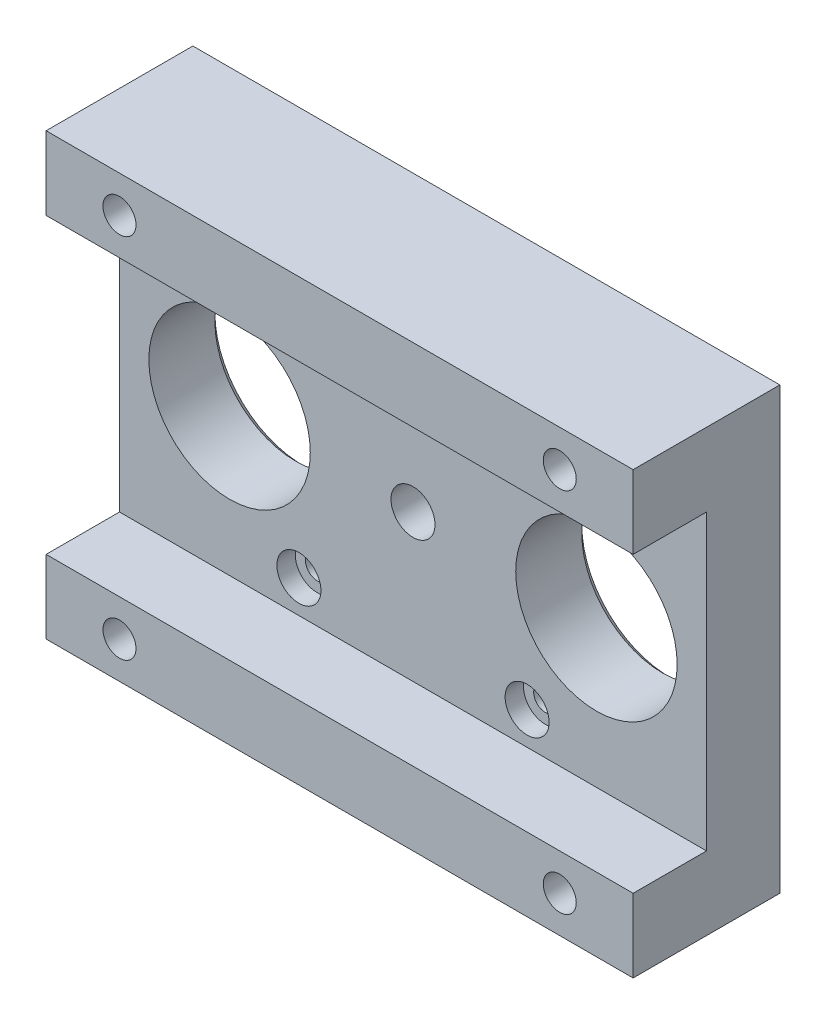
ISO-10303-21;
HEADER;
FILE_DESCRIPTION(('STEP AP214'),'2;1');
FILE_NAME('part.step','',(''),(''),'','','');
FILE_SCHEMA(('AUTOMOTIVE_DESIGN { 1 0 10303 214 1 1 1 1 }'));
ENDSEC;
DATA;
#1=APPLICATION_CONTEXT('core data for automotive mechanical design processes');
#2=APPLICATION_PROTOCOL_DEFINITION('international standard','automotive_design',2000,#1);
#3=PRODUCT_CONTEXT('',#1,'mechanical');
#4=PRODUCT('Part','Part','',(#3));
#5=PRODUCT_RELATED_PRODUCT_CATEGORY('part','',(#4));
#6=PRODUCT_DEFINITION_FORMATION('','',#4);
#7=PRODUCT_DEFINITION_CONTEXT('part definition',#1,'design');
#8=PRODUCT_DEFINITION('design','',#6,#7);
#9=PRODUCT_DEFINITION_SHAPE('','',#8);
#10=(LENGTH_UNIT() NAMED_UNIT(*) SI_UNIT(.MILLI.,.METRE.));
#11=(NAMED_UNIT(*) PLANE_ANGLE_UNIT() SI_UNIT($,.RADIAN.));
#12=(NAMED_UNIT(*) SI_UNIT($,.STERADIAN.) SOLID_ANGLE_UNIT());
#13=UNCERTAINTY_MEASURE_WITH_UNIT(LENGTH_MEASURE(1.E-05),#10,'distance_accuracy_value','');
#14=(GEOMETRIC_REPRESENTATION_CONTEXT(3) GLOBAL_UNCERTAINTY_ASSIGNED_CONTEXT((#13)) GLOBAL_UNIT_ASSIGNED_CONTEXT((#10,
#11,#12)) REPRESENTATION_CONTEXT('',''));
#15=CARTESIAN_POINT('',(0.,0.,0.));
#16=DIRECTION('',(0.,0.,1.));
#17=DIRECTION('',(1.,0.,0.));
#18=AXIS2_PLACEMENT_3D('',#15,#16,#17);
#19=CARTESIAN_POINT('',(-15.55,15.55,-2.2));
#20=DIRECTION('',(0.,0.,1.));
#21=DIRECTION('',(1.,0.,0.));
#22=AXIS2_PLACEMENT_3D('',#19,#20,#21);
#23=CYLINDRICAL_SURFACE('',#22,1.6);
#24=CARTESIAN_POINT('',(-15.55,15.55,0.));
#25=DIRECTION('',(0.,0.,1.));
#26=DIRECTION('',(1.,0.,0.));
#27=AXIS2_PLACEMENT_3D('',#24,#25,#26);
#28=CIRCLE('',#27,1.6);
#29=CARTESIAN_POINT('',(-13.95,15.55,0.));
#30=VERTEX_POINT('',#29);
#31=EDGE_CURVE('E183',#30,#30,#28,.T.);
#32=ORIENTED_EDGE('',*,*,#31,.F.);
#33=EDGE_LOOP('',(#32));
#34=FACE_BOUND('',#33,.T.);
#35=CARTESIAN_POINT('',(-15.55,15.55,7.5));
#36=DIRECTION('',(0.,0.,1.));
#37=DIRECTION('',(1.,0.,0.));
#38=AXIS2_PLACEMENT_3D('',#35,#36,#37);
#39=CIRCLE('',#38,1.6);
#40=CARTESIAN_POINT('',(-13.95,15.55,7.5));
#41=VERTEX_POINT('',#40);
#42=EDGE_CURVE('E187',#41,#41,#39,.F.);
#43=ORIENTED_EDGE('',*,*,#42,.F.);
#44=EDGE_LOOP('',(#43));
#45=FACE_BOUND('',#44,.T.);
#46=ADVANCED_FACE('F44',(#34,#45),#23,.F.);
#47=CARTESIAN_POINT('',(15.55,15.55,-2.2));
#48=DIRECTION('',(0.,0.,1.));
#49=DIRECTION('',(1.,0.,0.));
#50=AXIS2_PLACEMENT_3D('',#47,#48,#49);
#51=CYLINDRICAL_SURFACE('',#50,1.6);
#52=CARTESIAN_POINT('',(15.55,15.55,0.));
#53=DIRECTION('',(0.,0.,1.));
#54=DIRECTION('',(1.,0.,0.));
#55=AXIS2_PLACEMENT_3D('',#52,#53,#54);
#56=CIRCLE('',#55,1.6);
#57=CARTESIAN_POINT('',(17.15,15.55,0.));
#58=VERTEX_POINT('',#57);
#59=EDGE_CURVE('E186',#58,#58,#56,.T.);
#60=ORIENTED_EDGE('',*,*,#59,.F.);
#61=EDGE_LOOP('',(#60));
#62=FACE_BOUND('',#61,.T.);
#63=CARTESIAN_POINT('',(15.55,15.55,7.5));
#64=DIRECTION('',(0.,0.,1.));
#65=DIRECTION('',(1.,0.,0.));
#66=AXIS2_PLACEMENT_3D('',#63,#64,#65);
#67=CIRCLE('',#66,1.6);
#68=CARTESIAN_POINT('',(17.15,15.55,7.5));
#69=VERTEX_POINT('',#68);
#70=EDGE_CURVE('E204',#69,#69,#67,.F.);
#71=ORIENTED_EDGE('',*,*,#70,.F.);
#72=EDGE_LOOP('',(#71));
#73=FACE_BOUND('',#72,.T.);
#74=ADVANCED_FACE('F362',(#62,#73),#51,.F.);
#75=CARTESIAN_POINT('',(15.55,-15.55,-2.2));
#76=DIRECTION('',(0.,0.,1.));
#77=DIRECTION('',(1.,0.,0.));
#78=AXIS2_PLACEMENT_3D('',#75,#76,#77);
#79=CYLINDRICAL_SURFACE('',#78,1.6);
#80=CARTESIAN_POINT('',(15.55,-15.55,0.));
#81=DIRECTION('',(0.,0.,1.));
#82=DIRECTION('',(1.,0.,0.));
#83=AXIS2_PLACEMENT_3D('',#80,#81,#82);
#84=CIRCLE('',#83,1.6);
#85=CARTESIAN_POINT('',(17.15,-15.55,0.));
#86=VERTEX_POINT('',#85);
#87=EDGE_CURVE('E190',#86,#86,#84,.T.);
#88=ORIENTED_EDGE('',*,*,#87,.F.);
#89=EDGE_LOOP('',(#88));
#90=FACE_BOUND('',#89,.T.);
#91=CARTESIAN_POINT('',(15.55,-15.55,7.5));
#92=DIRECTION('',(0.,0.,1.));
#93=DIRECTION('',(1.,0.,0.));
#94=AXIS2_PLACEMENT_3D('',#91,#92,#93);
#95=CIRCLE('',#94,1.6);
#96=CARTESIAN_POINT('',(17.15,-15.55,7.5));
#97=VERTEX_POINT('',#96);
#98=EDGE_CURVE('E200',#97,#97,#95,.F.);
#99=ORIENTED_EDGE('',*,*,#98,.F.);
#100=EDGE_LOOP('',(#99));
#101=FACE_BOUND('',#100,.T.);
#102=ADVANCED_FACE('F368',(#90,#101),#79,.F.);
#103=CARTESIAN_POINT('',(-15.55,-15.55,-2.2));
#104=DIRECTION('',(0.,0.,1.));
#105=DIRECTION('',(1.,0.,0.));
#106=AXIS2_PLACEMENT_3D('',#103,#104,#105);
#107=CYLINDRICAL_SURFACE('',#106,1.6);
#108=CARTESIAN_POINT('',(-15.55,-15.55,0.));
#109=DIRECTION('',(0.,0.,1.));
#110=DIRECTION('',(1.,0.,0.));
#111=AXIS2_PLACEMENT_3D('',#108,#109,#110);
#112=CIRCLE('',#111,1.6);
#113=CARTESIAN_POINT('',(-13.95,-15.55,0.));
#114=VERTEX_POINT('',#113);
#115=EDGE_CURVE('E193',#114,#114,#112,.T.);
#116=ORIENTED_EDGE('',*,*,#115,.F.);
#117=EDGE_LOOP('',(#116));
#118=FACE_BOUND('',#117,.T.);
#119=CARTESIAN_POINT('',(-15.55,-15.55,7.5));
#120=DIRECTION('',(0.,0.,1.));
#121=DIRECTION('',(1.,0.,0.));
#122=AXIS2_PLACEMENT_3D('',#119,#120,#121);
#123=CIRCLE('',#122,1.6);
#124=CARTESIAN_POINT('',(-13.95,-15.55,7.5));
#125=VERTEX_POINT('',#124);
#126=EDGE_CURVE('E197',#125,#125,#123,.F.);
#127=ORIENTED_EDGE('',*,*,#126,.F.);
#128=EDGE_LOOP('',(#127));
#129=FACE_BOUND('',#128,.T.);
#130=ADVANCED_FACE('F327',(#118,#129),#107,.F.);
#131=CARTESIAN_POINT('',(0.,0.,10.));
#132=DIRECTION('',(0.,0.,1.));
#133=DIRECTION('',(1.,0.,0.));
#134=AXIS2_PLACEMENT_3D('',#131,#132,#133);
#135=PLANE('',#134);
#136=CARTESIAN_POINT('',(15.55,15.55,10.));
#137=DIRECTION('',(0.,0.,1.));
#138=DIRECTION('',(1.,0.,0.));
#139=AXIS2_PLACEMENT_3D('',#136,#137,#138);
#140=CIRCLE('',#139,3.);
#141=CARTESIAN_POINT('',(18.55,15.55,10.));
#142=VERTEX_POINT('',#141);
#143=EDGE_CURVE('E301',#142,#142,#140,.T.);
#144=ORIENTED_EDGE('',*,*,#143,.F.);
#145=EDGE_LOOP('',(#144));
#146=FACE_BOUND('',#145,.T.);
#147=CARTESIAN_POINT('',(-15.55,-15.55,10.));
#148=DIRECTION('',(0.,0.,1.));
#149=DIRECTION('',(1.,0.,0.));
#150=AXIS2_PLACEMENT_3D('',#147,#148,#149);
#151=CIRCLE('',#150,3.);
#152=CARTESIAN_POINT('',(-12.55,-15.55,10.));
#153=VERTEX_POINT('',#152);
#154=EDGE_CURVE('E307',#153,#153,#151,.T.);
#155=ORIENTED_EDGE('',*,*,#154,.F.);
#156=EDGE_LOOP('',(#155));
#157=FACE_BOUND('',#156,.T.);
#158=CARTESIAN_POINT('',(15.55,-15.55,10.));
#159=DIRECTION('',(0.,0.,1.));
#160=DIRECTION('',(1.,0.,0.));
#161=AXIS2_PLACEMENT_3D('',#158,#159,#160);
#162=CIRCLE('',#161,3.);
#163=CARTESIAN_POINT('',(18.55,-15.55,10.));
#164=VERTEX_POINT('',#163);
#165=EDGE_CURVE('E308',#164,#164,#162,.T.);
#166=ORIENTED_EDGE('',*,*,#165,.F.);
#167=EDGE_LOOP('',(#166));
#168=FACE_BOUND('',#167,.T.);
#169=CARTESIAN_POINT('',(-15.55,15.55,10.));
#170=DIRECTION('',(0.,0.,1.));
#171=DIRECTION('',(1.,0.,0.));
#172=AXIS2_PLACEMENT_3D('',#169,#170,#171);
#173=CIRCLE('',#172,3.);
#174=CARTESIAN_POINT('',(-12.55,15.55,10.));
#175=VERTEX_POINT('',#174);
#176=EDGE_CURVE('E298',#175,#175,#173,.T.);
#177=ORIENTED_EDGE('',*,*,#176,.F.);
#178=EDGE_LOOP('',(#177));
#179=FACE_BOUND('',#178,.T.);
#180=CARTESIAN_POINT('',(-25.,0.,10.));
#181=DIRECTION('',(0.,0.,1.));
#182=DIRECTION('',(1.,0.,0.));
#183=AXIS2_PLACEMENT_3D('',#180,#181,#182);
#184=CIRCLE('',#183,11.);
#185=CARTESIAN_POINT('',(-14.,0.,10.));
#186=VERTEX_POINT('',#185);
#187=EDGE_CURVE('E280',#186,#186,#184,.T.);
#188=ORIENTED_EDGE('',*,*,#187,.F.);
#189=EDGE_LOOP('',(#188));
#190=FACE_BOUND('',#189,.T.);
#191=CARTESIAN_POINT('',(25.,0.,10.));
#192=DIRECTION('',(0.,0.,1.));
#193=DIRECTION('',(1.,0.,0.));
#194=AXIS2_PLACEMENT_3D('',#191,#192,#193);
#195=CIRCLE('',#194,11.);
#196=CARTESIAN_POINT('',(36.,0.,10.));
#197=VERTEX_POINT('',#196);
#198=EDGE_CURVE('E196',#197,#197,#195,.T.);
#199=ORIENTED_EDGE('',*,*,#198,.F.);
#200=EDGE_LOOP('',(#199));
#201=FACE_BOUND('',#200,.T.);
#202=CARTESIAN_POINT('',(0.,0.,10.));
#203=DIRECTION('',(0.,0.,1.));
#204=DIRECTION('',(1.,0.,0.));
#205=AXIS2_PLACEMENT_3D('',#202,#203,#204);
#206=CIRCLE('',#205,3.);
#207=CARTESIAN_POINT('',(-3.,0.,10.));
#208=VERTEX_POINT('',#207);
#209=EDGE_CURVE('E178',#208,#208,#206,.T.);
#210=ORIENTED_EDGE('',*,*,#209,.F.);
#211=EDGE_LOOP('',(#210));
#212=FACE_BOUND('',#211,.T.);
#213=DIRECTION('',(0.,-1.,0.));
#214=VECTOR('',#213,1.);
#215=CARTESIAN_POINT('',(-40.,30.,10.));
#216=LINE('',#215,#214);
#217=CARTESIAN_POINT('',(-40.,20.,10.));
#218=VERTEX_POINT('',#217);
#219=CARTESIAN_POINT('',(-40.,-20.,10.));
#220=VERTEX_POINT('',#219);
#221=EDGE_CURVE('E65',#218,#220,#216,.T.);
#222=ORIENTED_EDGE('',*,*,#221,.T.);
#223=DIRECTION('',(-1.,0.,0.));
#224=VECTOR('',#223,1.);
#225=CARTESIAN_POINT('',(40.,-20.,10.));
#226=LINE('',#225,#224);
#227=CARTESIAN_POINT('',(40.,-20.,10.));
#228=VERTEX_POINT('',#227);
#229=EDGE_CURVE('E60',#228,#220,#226,.T.);
#230=ORIENTED_EDGE('',*,*,#229,.F.);
#231=DIRECTION('',(0.,1.,0.));
#232=VECTOR('',#231,1.);
#233=CARTESIAN_POINT('',(40.,30.,10.));
#234=LINE('',#233,#232);
#235=CARTESIAN_POINT('',(40.,20.,10.));
#236=VERTEX_POINT('',#235);
#237=EDGE_CURVE('E161',#228,#236,#234,.T.);
#238=ORIENTED_EDGE('',*,*,#237,.T.);
#239=DIRECTION('',(1.,0.,0.));
#240=VECTOR('',#239,1.);
#241=CARTESIAN_POINT('',(-40.,20.,10.));
#242=LINE('',#241,#240);
#243=EDGE_CURVE('E136',#218,#236,#242,.T.);
#244=ORIENTED_EDGE('',*,*,#243,.F.);
#245=EDGE_LOOP('',(#222,#230,#238,#244));
#246=FACE_BOUND('',#245,.T.);
#247=ADVANCED_FACE('F324',(#146,#157,#168,#179,#190,#201,#212,#246),#135,.T.);
#248=CARTESIAN_POINT('',(40.,30.,10.));
#249=DIRECTION('',(-1.,0.,0.));
#250=DIRECTION('',(0.,-1.,0.));
#251=AXIS2_PLACEMENT_3D('',#248,#249,#250);
#252=PLANE('',#251);
#253=DIRECTION('',(0.,1.,0.));
#254=VECTOR('',#253,1.);
#255=CARTESIAN_POINT('',(40.,30.,0.));
#256=LINE('',#255,#254);
#257=CARTESIAN_POINT('',(40.,-30.,0.));
#258=VERTEX_POINT('',#257);
#259=CARTESIAN_POINT('',(40.,30.,0.));
#260=VERTEX_POINT('',#259);
#261=EDGE_CURVE('E160',#258,#260,#256,.T.);
#262=ORIENTED_EDGE('',*,*,#261,.T.);
#263=DIRECTION('',(0.,0.,-1.));
#264=VECTOR('',#263,1.);
#265=CARTESIAN_POINT('',(40.,30.,10.));
#266=LINE('',#265,#264);
#267=CARTESIAN_POINT('',(40.,30.,20.));
#268=VERTEX_POINT('',#267);
#269=EDGE_CURVE('E174',#268,#260,#266,.T.);
#270=ORIENTED_EDGE('',*,*,#269,.F.);
#271=DIRECTION('',(0.,1.,0.));
#272=VECTOR('',#271,1.);
#273=CARTESIAN_POINT('',(40.,30.,20.));
#274=LINE('',#273,#272);
#275=CARTESIAN_POINT('',(40.,20.,20.));
#276=VERTEX_POINT('',#275);
#277=EDGE_CURVE('E146',#276,#268,#274,.T.);
#278=ORIENTED_EDGE('',*,*,#277,.F.);
#279=DIRECTION('',(0.,0.,-1.));
#280=VECTOR('',#279,1.);
#281=CARTESIAN_POINT('',(40.,20.,20.));
#282=LINE('',#281,#280);
#283=EDGE_CURVE('E152',#276,#236,#282,.T.);
#284=ORIENTED_EDGE('',*,*,#283,.T.);
#285=ORIENTED_EDGE('',*,*,#237,.F.);
#286=DIRECTION('',(0.,0.,-1.));
#287=VECTOR('',#286,1.);
#288=CARTESIAN_POINT('',(40.,-20.,20.));
#289=LINE('',#288,#287);
#290=CARTESIAN_POINT('',(40.,-20.,20.));
#291=VERTEX_POINT('',#290);
#292=EDGE_CURVE('E133',#291,#228,#289,.T.);
#293=ORIENTED_EDGE('',*,*,#292,.F.);
#294=DIRECTION('',(0.,1.,0.));
#295=VECTOR('',#294,1.);
#296=CARTESIAN_POINT('',(40.,-30.,20.));
#297=LINE('',#296,#295);
#298=CARTESIAN_POINT('',(40.,-30.,20.));
#299=VERTEX_POINT('',#298);
#300=EDGE_CURVE('E125',#299,#291,#297,.T.);
#301=ORIENTED_EDGE('',*,*,#300,.F.);
#302=DIRECTION('',(0.,0.,-1.));
#303=VECTOR('',#302,1.);
#304=CARTESIAN_POINT('',(40.,-30.,10.));
#305=LINE('',#304,#303);
#306=EDGE_CURVE('E108',#299,#258,#305,.T.);
#307=ORIENTED_EDGE('',*,*,#306,.T.);
#308=EDGE_LOOP('',(#262,#270,#278,#284,#285,#293,#301,#307));
#309=FACE_BOUND('',#308,.T.);
#310=ADVANCED_FACE('F131',(#309),#252,.F.);
#311=CARTESIAN_POINT('',(-40.,30.,10.));
#312=DIRECTION('',(0.,-1.,0.));
#313=DIRECTION('',(0.,0.,-1.));
#314=AXIS2_PLACEMENT_3D('',#311,#312,#313);
#315=PLANE('',#314);
#316=DIRECTION('',(-1.,0.,0.));
#317=VECTOR('',#316,1.);
#318=CARTESIAN_POINT('',(-40.,30.,0.));
#319=LINE('',#318,#317);
#320=CARTESIAN_POINT('',(-40.,30.,0.));
#321=VERTEX_POINT('',#320);
#322=EDGE_CURVE('E165',#260,#321,#319,.T.);
#323=ORIENTED_EDGE('',*,*,#322,.T.);
#324=DIRECTION('',(0.,0.,-1.));
#325=VECTOR('',#324,1.);
#326=CARTESIAN_POINT('',(-40.,30.,10.));
#327=LINE('',#326,#325);
#328=CARTESIAN_POINT('',(-40.,30.,20.));
#329=VERTEX_POINT('',#328);
#330=EDGE_CURVE('E171',#329,#321,#327,.T.);
#331=ORIENTED_EDGE('',*,*,#330,.F.);
#332=DIRECTION('',(-1.,0.,0.));
#333=VECTOR('',#332,1.);
#334=CARTESIAN_POINT('',(-40.,30.,20.));
#335=LINE('',#334,#333);
#336=EDGE_CURVE('E149',#268,#329,#335,.T.);
#337=ORIENTED_EDGE('',*,*,#336,.F.);
#338=ORIENTED_EDGE('',*,*,#269,.T.);
#339=EDGE_LOOP('',(#323,#331,#337,#338));
#340=FACE_BOUND('',#339,.T.);
#341=ADVANCED_FACE('F251',(#340),#315,.F.);
#342=CARTESIAN_POINT('',(-40.,30.,10.));
#343=DIRECTION('',(1.,0.,0.));
#344=DIRECTION('',(0.,1.,0.));
#345=AXIS2_PLACEMENT_3D('',#342,#343,#344);
#346=PLANE('',#345);
#347=DIRECTION('',(0.,-1.,0.));
#348=VECTOR('',#347,1.);
#349=CARTESIAN_POINT('',(-40.,30.,0.));
#350=LINE('',#349,#348);
#351=CARTESIAN_POINT('',(-40.,-30.,0.));
#352=VERTEX_POINT('',#351);
#353=EDGE_CURVE('E167',#321,#352,#350,.T.);
#354=ORIENTED_EDGE('',*,*,#353,.T.);
#355=DIRECTION('',(0.,0.,-1.));
#356=VECTOR('',#355,1.);
#357=CARTESIAN_POINT('',(-40.,-30.,10.));
#358=LINE('',#357,#356);
#359=CARTESIAN_POINT('',(-40.,-30.,20.));
#360=VERTEX_POINT('',#359);
#361=EDGE_CURVE('E119',#360,#352,#358,.T.);
#362=ORIENTED_EDGE('',*,*,#361,.F.);
#363=DIRECTION('',(0.,-1.,0.));
#364=VECTOR('',#363,1.);
#365=CARTESIAN_POINT('',(-40.,-30.,20.));
#366=LINE('',#365,#364);
#367=CARTESIAN_POINT('',(-40.,-20.,20.));
#368=VERTEX_POINT('',#367);
#369=EDGE_CURVE('E128',#368,#360,#366,.T.);
#370=ORIENTED_EDGE('',*,*,#369,.F.);
#371=DIRECTION('',(0.,0.,-1.));
#372=VECTOR('',#371,1.);
#373=CARTESIAN_POINT('',(-40.,-20.,20.));
#374=LINE('',#373,#372);
#375=EDGE_CURVE('E129',#368,#220,#374,.T.);
#376=ORIENTED_EDGE('',*,*,#375,.T.);
#377=ORIENTED_EDGE('',*,*,#221,.F.);
#378=DIRECTION('',(0.,0.,-1.));
#379=VECTOR('',#378,1.);
#380=CARTESIAN_POINT('',(-40.,20.,20.));
#381=LINE('',#380,#379);
#382=CARTESIAN_POINT('',(-40.,20.,20.));
#383=VERTEX_POINT('',#382);
#384=EDGE_CURVE('E157',#383,#218,#381,.T.);
#385=ORIENTED_EDGE('',*,*,#384,.F.);
#386=DIRECTION('',(0.,-1.,0.));
#387=VECTOR('',#386,1.);
#388=CARTESIAN_POINT('',(-40.,30.,20.));
#389=LINE('',#388,#387);
#390=EDGE_CURVE('E141',#329,#383,#389,.T.);
#391=ORIENTED_EDGE('',*,*,#390,.F.);
#392=ORIENTED_EDGE('',*,*,#330,.T.);
#393=EDGE_LOOP('',(#354,#362,#370,#376,#377,#385,#391,#392));
#394=FACE_BOUND('',#393,.T.);
#395=ADVANCED_FACE('F253',(#394),#346,.F.);
#396=CARTESIAN_POINT('',(-40.,-30.,10.));
#397=DIRECTION('',(0.,1.,0.));
#398=DIRECTION('',(0.,0.,1.));
#399=AXIS2_PLACEMENT_3D('',#396,#397,#398);
#400=PLANE('',#399);
#401=DIRECTION('',(1.,0.,0.));
#402=VECTOR('',#401,1.);
#403=CARTESIAN_POINT('',(-40.,-30.,0.));
#404=LINE('',#403,#402);
#405=EDGE_CURVE('E114',#352,#258,#404,.T.);
#406=ORIENTED_EDGE('',*,*,#405,.T.);
#407=ORIENTED_EDGE('',*,*,#306,.F.);
#408=DIRECTION('',(1.,0.,0.));
#409=VECTOR('',#408,1.);
#410=CARTESIAN_POINT('',(40.,-30.,20.));
#411=LINE('',#410,#409);
#412=EDGE_CURVE('E112',#360,#299,#411,.T.);
#413=ORIENTED_EDGE('',*,*,#412,.F.);
#414=ORIENTED_EDGE('',*,*,#361,.T.);
#415=EDGE_LOOP('',(#406,#407,#413,#414));
#416=FACE_BOUND('',#415,.T.);
#417=ADVANCED_FACE('F110',(#416),#400,.F.);
#418=CARTESIAN_POINT('',(0.,0.,0.));
#419=DIRECTION('',(0.,0.,1.));
#420=DIRECTION('',(1.,0.,0.));
#421=AXIS2_PLACEMENT_3D('',#418,#419,#420);
#422=PLANE('',#421);
#423=CARTESIAN_POINT('',(25.,0.,0.));
#424=DIRECTION('',(0.,0.,1.));
#425=DIRECTION('',(1.,0.,0.));
#426=AXIS2_PLACEMENT_3D('',#423,#424,#425);
#427=CIRCLE('',#426,12.);
#428=CARTESIAN_POINT('',(37.,0.,0.));
#429=VERTEX_POINT('',#428);
#430=EDGE_CURVE('E211',#429,#429,#427,.T.);
#431=ORIENTED_EDGE('',*,*,#430,.T.);
#432=EDGE_LOOP('',(#431));
#433=FACE_BOUND('',#432,.T.);
#434=CARTESIAN_POINT('',(-25.,0.,0.));
#435=DIRECTION('',(0.,0.,1.));
#436=DIRECTION('',(1.,0.,0.));
#437=AXIS2_PLACEMENT_3D('',#434,#435,#436);
#438=CIRCLE('',#437,12.);
#439=CARTESIAN_POINT('',(-13.,0.,0.));
#440=VERTEX_POINT('',#439);
#441=EDGE_CURVE('E177',#440,#440,#438,.T.);
#442=ORIENTED_EDGE('',*,*,#441,.T.);
#443=EDGE_LOOP('',(#442));
#444=FACE_BOUND('',#443,.T.);
#445=ORIENTED_EDGE('',*,*,#115,.T.);
#446=EDGE_LOOP('',(#445));
#447=FACE_BOUND('',#446,.T.);
#448=ORIENTED_EDGE('',*,*,#87,.T.);
#449=EDGE_LOOP('',(#448));
#450=FACE_BOUND('',#449,.T.);
#451=ORIENTED_EDGE('',*,*,#59,.T.);
#452=EDGE_LOOP('',(#451));
#453=FACE_BOUND('',#452,.T.);
#454=ORIENTED_EDGE('',*,*,#31,.T.);
#455=EDGE_LOOP('',(#454));
#456=FACE_BOUND('',#455,.T.);
#457=CARTESIAN_POINT('',(0.,0.,0.));
#458=DIRECTION('',(0.,0.,-1.));
#459=DIRECTION('',(-1.,0.,0.));
#460=AXIS2_PLACEMENT_3D('',#457,#458,#459);
#461=CIRCLE('',#460,11.35);
#462=CARTESIAN_POINT('',(-11.35,0.,0.));
#463=VERTEX_POINT('',#462);
#464=EDGE_CURVE('E181',#463,#463,#461,.T.);
#465=ORIENTED_EDGE('',*,*,#464,.F.);
#466=EDGE_LOOP('',(#465));
#467=FACE_BOUND('',#466,.T.);
#468=ORIENTED_EDGE('',*,*,#261,.F.);
#469=ORIENTED_EDGE('',*,*,#405,.F.);
#470=ORIENTED_EDGE('',*,*,#353,.F.);
#471=ORIENTED_EDGE('',*,*,#322,.F.);
#472=EDGE_LOOP('',(#468,#469,#470,#471));
#473=FACE_BOUND('',#472,.T.);
#474=ADVANCED_FACE('F225',(#433,#444,#447,#450,#453,#456,#467,#473),#422,.F.);
#475=CARTESIAN_POINT('',(-40.,20.,20.));
#476=DIRECTION('',(0.,1.,0.));
#477=DIRECTION('',(-1.,0.,0.));
#478=AXIS2_PLACEMENT_3D('',#475,#476,#477);
#479=PLANE('',#478);
#480=ORIENTED_EDGE('',*,*,#243,.T.);
#481=ORIENTED_EDGE('',*,*,#283,.F.);
#482=DIRECTION('',(1.,0.,0.));
#483=VECTOR('',#482,1.);
#484=CARTESIAN_POINT('',(-40.,20.,20.));
#485=LINE('',#484,#483);
#486=EDGE_CURVE('E144',#383,#276,#485,.T.);
#487=ORIENTED_EDGE('',*,*,#486,.F.);
#488=ORIENTED_EDGE('',*,*,#384,.T.);
#489=EDGE_LOOP('',(#480,#481,#487,#488));
#490=FACE_BOUND('',#489,.T.);
#491=ADVANCED_FACE('F228',(#490),#479,.F.);
#492=CARTESIAN_POINT('',(0.,0.,20.));
#493=DIRECTION('',(0.,0.,1.));
#494=DIRECTION('',(1.,0.,0.));
#495=AXIS2_PLACEMENT_3D('',#492,#493,#494);
#496=PLANE('',#495);
#497=CARTESIAN_POINT('',(-30.,25.,20.));
#498=DIRECTION('',(0.,0.,1.));
#499=DIRECTION('',(1.,0.,0.));
#500=AXIS2_PLACEMENT_3D('',#497,#498,#499);
#501=CIRCLE('',#500,2.25);
#502=CARTESIAN_POINT('',(-27.75,25.,20.));
#503=VERTEX_POINT('',#502);
#504=EDGE_CURVE('E273',#503,#503,#501,.T.);
#505=ORIENTED_EDGE('',*,*,#504,.F.);
#506=EDGE_LOOP('',(#505));
#507=FACE_BOUND('',#506,.T.);
#508=CARTESIAN_POINT('',(30.,25.,20.));
#509=DIRECTION('',(0.,0.,1.));
#510=DIRECTION('',(1.,0.,0.));
#511=AXIS2_PLACEMENT_3D('',#508,#509,#510);
#512=CIRCLE('',#511,2.25);
#513=CARTESIAN_POINT('',(32.25,25.,20.));
#514=VERTEX_POINT('',#513);
#515=EDGE_CURVE('E270',#514,#514,#512,.T.);
#516=ORIENTED_EDGE('',*,*,#515,.F.);
#517=EDGE_LOOP('',(#516));
#518=FACE_BOUND('',#517,.T.);
#519=ORIENTED_EDGE('',*,*,#390,.T.);
#520=ORIENTED_EDGE('',*,*,#486,.T.);
#521=ORIENTED_EDGE('',*,*,#277,.T.);
#522=ORIENTED_EDGE('',*,*,#336,.T.);
#523=EDGE_LOOP('',(#519,#520,#521,#522));
#524=FACE_BOUND('',#523,.T.);
#525=ADVANCED_FACE('F248',(#507,#518,#524),#496,.T.);
#526=CARTESIAN_POINT('',(40.,-20.,20.));
#527=DIRECTION('',(0.,-1.,0.));
#528=DIRECTION('',(1.,0.,0.));
#529=AXIS2_PLACEMENT_3D('',#526,#527,#528);
#530=PLANE('',#529);
#531=ORIENTED_EDGE('',*,*,#229,.T.);
#532=ORIENTED_EDGE('',*,*,#375,.F.);
#533=DIRECTION('',(-1.,0.,0.));
#534=VECTOR('',#533,1.);
#535=CARTESIAN_POINT('',(40.,-20.,20.));
#536=LINE('',#535,#534);
#537=EDGE_CURVE('E134',#291,#368,#536,.T.);
#538=ORIENTED_EDGE('',*,*,#537,.F.);
#539=ORIENTED_EDGE('',*,*,#292,.T.);
#540=EDGE_LOOP('',(#531,#532,#538,#539));
#541=FACE_BOUND('',#540,.T.);
#542=ADVANCED_FACE('F258',(#541),#530,.F.);
#543=CARTESIAN_POINT('',(0.,0.,20.));
#544=DIRECTION('',(0.,0.,1.));
#545=DIRECTION('',(1.,0.,0.));
#546=AXIS2_PLACEMENT_3D('',#543,#544,#545);
#547=PLANE('',#546);
#548=CARTESIAN_POINT('',(30.,-25.,20.));
#549=DIRECTION('',(0.,0.,1.));
#550=DIRECTION('',(1.,0.,0.));
#551=AXIS2_PLACEMENT_3D('',#548,#549,#550);
#552=CIRCLE('',#551,2.25);
#553=CARTESIAN_POINT('',(32.25,-25.,20.));
#554=VERTEX_POINT('',#553);
#555=EDGE_CURVE('E279',#554,#554,#552,.T.);
#556=ORIENTED_EDGE('',*,*,#555,.F.);
#557=EDGE_LOOP('',(#556));
#558=FACE_BOUND('',#557,.T.);
#559=CARTESIAN_POINT('',(-30.,-25.,20.));
#560=DIRECTION('',(0.,0.,1.));
#561=DIRECTION('',(1.,0.,0.));
#562=AXIS2_PLACEMENT_3D('',#559,#560,#561);
#563=CIRCLE('',#562,2.25);
#564=CARTESIAN_POINT('',(-27.75,-25.,20.));
#565=VERTEX_POINT('',#564);
#566=EDGE_CURVE('E286',#565,#565,#563,.T.);
#567=ORIENTED_EDGE('',*,*,#566,.F.);
#568=EDGE_LOOP('',(#567));
#569=FACE_BOUND('',#568,.T.);
#570=ORIENTED_EDGE('',*,*,#300,.T.);
#571=ORIENTED_EDGE('',*,*,#537,.T.);
#572=ORIENTED_EDGE('',*,*,#369,.T.);
#573=ORIENTED_EDGE('',*,*,#412,.T.);
#574=EDGE_LOOP('',(#570,#571,#572,#573));
#575=FACE_BOUND('',#574,.T.);
#576=ADVANCED_FACE('F124',(#558,#569,#575),#547,.T.);
#577=CARTESIAN_POINT('',(0.,0.,2.2));
#578=DIRECTION('',(0.,0.,-1.));
#579=DIRECTION('',(-1.,0.,0.));
#580=AXIS2_PLACEMENT_3D('',#577,#578,#579);
#581=CYLINDRICAL_SURFACE('',#580,11.35);
#582=CARTESIAN_POINT('',(0.,0.,2.2));
#583=DIRECTION('',(0.,0.,-1.));
#584=DIRECTION('',(-1.,0.,0.));
#585=AXIS2_PLACEMENT_3D('',#582,#583,#584);
#586=CIRCLE('',#585,11.35);
#587=CARTESIAN_POINT('',(-11.35,0.,2.2));
#588=VERTEX_POINT('',#587);
#589=EDGE_CURVE('E260',#588,#588,#586,.T.);
#590=ORIENTED_EDGE('',*,*,#589,.F.);
#591=EDGE_LOOP('',(#590));
#592=FACE_BOUND('',#591,.T.);
#593=ORIENTED_EDGE('',*,*,#464,.T.);
#594=EDGE_LOOP('',(#593));
#595=FACE_BOUND('',#594,.T.);
#596=ADVANCED_FACE('F348',(#592,#595),#581,.F.);
#597=CARTESIAN_POINT('',(0.,0.,2.2));
#598=DIRECTION('',(0.,0.,-1.));
#599=DIRECTION('',(-1.,0.,0.));
#600=AXIS2_PLACEMENT_3D('',#597,#598,#599);
#601=PLANE('',#600);
#602=CARTESIAN_POINT('',(0.,0.,2.2));
#603=DIRECTION('',(0.,0.,-1.));
#604=DIRECTION('',(-1.,0.,0.));
#605=AXIS2_PLACEMENT_3D('',#602,#603,#604);
#606=CIRCLE('',#605,3.);
#607=CARTESIAN_POINT('',(-3.,0.,2.2));
#608=VERTEX_POINT('',#607);
#609=EDGE_CURVE('E182',#608,#608,#606,.T.);
#610=ORIENTED_EDGE('',*,*,#609,.F.);
#611=EDGE_LOOP('',(#610));
#612=FACE_BOUND('',#611,.T.);
#613=ORIENTED_EDGE('',*,*,#589,.T.);
#614=EDGE_LOOP('',(#613));
#615=FACE_BOUND('',#614,.T.);
#616=ADVANCED_FACE('F342',(#612,#615),#601,.T.);
#617=CARTESIAN_POINT('',(0.,0.,14.4));
#618=DIRECTION('',(0.,0.,-1.));
#619=DIRECTION('',(-1.,0.,0.));
#620=AXIS2_PLACEMENT_3D('',#617,#618,#619);
#621=CYLINDRICAL_SURFACE('',#620,3.);
#622=CARTESIAN_POINT('',(-3.,0.,10.));
#623=CARTESIAN_POINT('',(-3.,0.,9.91875));
#624=CARTESIAN_POINT('',(-3.,0.,9.8375));
#625=CARTESIAN_POINT('',(-3.,0.,9.675));
#626=CARTESIAN_POINT('',(-3.,0.,9.59375));
#627=CARTESIAN_POINT('',(-3.,0.,9.43125));
#628=CARTESIAN_POINT('',(-3.,0.,9.35));
#629=CARTESIAN_POINT('',(-3.,0.,9.1875));
#630=CARTESIAN_POINT('',(-3.,0.,9.10625));
#631=CARTESIAN_POINT('',(-3.,0.,8.94375));
#632=CARTESIAN_POINT('',(-3.,0.,8.8625));
#633=CARTESIAN_POINT('',(-3.,0.,8.7));
#634=CARTESIAN_POINT('',(-3.,0.,8.61875));
#635=CARTESIAN_POINT('',(-3.,0.,8.45625));
#636=CARTESIAN_POINT('',(-3.,0.,8.375));
#637=CARTESIAN_POINT('',(-3.,0.,8.2125));
#638=CARTESIAN_POINT('',(-3.,0.,8.13125));
#639=CARTESIAN_POINT('',(-3.,0.,7.96875));
#640=CARTESIAN_POINT('',(-3.,0.,7.8875));
#641=CARTESIAN_POINT('',(-3.,0.,7.725));
#642=CARTESIAN_POINT('',(-3.,0.,7.64375));
#643=CARTESIAN_POINT('',(-3.,0.,7.48125));
#644=CARTESIAN_POINT('',(-3.,0.,7.4));
#645=CARTESIAN_POINT('',(-3.,0.,7.2375));
#646=CARTESIAN_POINT('',(-3.,0.,7.15625));
#647=CARTESIAN_POINT('',(-3.,0.,6.99375));
#648=CARTESIAN_POINT('',(-3.,0.,6.9125));
#649=CARTESIAN_POINT('',(-3.,0.,6.75));
#650=CARTESIAN_POINT('',(-3.,0.,6.66875));
#651=CARTESIAN_POINT('',(-3.,0.,6.50625));
#652=CARTESIAN_POINT('',(-3.,0.,6.425));
#653=CARTESIAN_POINT('',(-3.,0.,6.2625));
#654=CARTESIAN_POINT('',(-3.,0.,6.18125));
#655=CARTESIAN_POINT('',(-3.,0.,6.01875));
#656=CARTESIAN_POINT('',(-3.,0.,5.9375));
#657=CARTESIAN_POINT('',(-3.,0.,5.775));
#658=CARTESIAN_POINT('',(-3.,0.,5.69375));
#659=CARTESIAN_POINT('',(-3.,0.,5.53125));
#660=CARTESIAN_POINT('',(-3.,0.,5.45));
#661=CARTESIAN_POINT('',(-3.,0.,5.2875));
#662=CARTESIAN_POINT('',(-3.,0.,5.20625));
#663=CARTESIAN_POINT('',(-3.,0.,5.04375));
#664=CARTESIAN_POINT('',(-3.,0.,4.9625));
#665=CARTESIAN_POINT('',(-3.,0.,4.8));
#666=CARTESIAN_POINT('',(-3.,0.,4.71875));
#667=CARTESIAN_POINT('',(-3.,0.,4.55625));
#668=CARTESIAN_POINT('',(-3.,0.,4.475));
#669=CARTESIAN_POINT('',(-3.,0.,4.3125));
#670=CARTESIAN_POINT('',(-3.,0.,4.23125));
#671=CARTESIAN_POINT('',(-3.,0.,4.06875));
#672=CARTESIAN_POINT('',(-3.,0.,3.9875));
#673=CARTESIAN_POINT('',(-3.,0.,3.825));
#674=CARTESIAN_POINT('',(-3.,0.,3.74375));
#675=CARTESIAN_POINT('',(-3.,0.,3.58125));
#676=CARTESIAN_POINT('',(-3.,0.,3.5));
#677=CARTESIAN_POINT('',(-3.,0.,3.3375));
#678=CARTESIAN_POINT('',(-3.,0.,3.25625));
#679=CARTESIAN_POINT('',(-3.,0.,3.09375));
#680=CARTESIAN_POINT('',(-3.,0.,3.0125));
#681=CARTESIAN_POINT('',(-3.,0.,2.85));
#682=CARTESIAN_POINT('',(-3.,0.,2.76875));
#683=CARTESIAN_POINT('',(-3.,0.,2.60625));
#684=CARTESIAN_POINT('',(-3.,0.,2.525));
#685=CARTESIAN_POINT('',(-3.,0.,2.3625));
#686=CARTESIAN_POINT('',(-3.,0.,2.28125));
#687=CARTESIAN_POINT('',(-3.,0.,2.2));
#688=B_SPLINE_CURVE_WITH_KNOTS('',3,(#622,#623,#624,#625,#626,#627,#628,#629,#630,#631,#632,
#633,#634,#635,#636,#637,#638,#639,#640,#641,#642,#643,#644,#645,#646,#647,#648,#649,#650,#651,
#652,#653,#654,#655,#656,#657,#658,#659,#660,#661,#662,#663,#664,#665,#666,#667,#668,#669,#670,
#671,#672,#673,#674,#675,#676,#677,#678,#679,#680,#681,#682,#683,#684,#685,#686,#687),
.UNSPECIFIED.,.F.,.F.,(4,2,2,2,2,2,2,2,2,2,2,2,2,2,2,2,2,2,2,2,2,2,2,2,2,2,2,2,2,2,2,2,4),(0.,
0.243749999999999,0.487499999999998,0.731249999999999,0.975,1.21875,1.4625,1.70625,1.95,2.19375,
2.4375,2.68125,2.925,3.16875,3.4125,3.65625,3.9,4.14375,4.3875,4.63125,4.875,5.11875,5.3625,
5.60625,5.85,6.09375,6.3375,6.58125,6.825,7.06875,7.3125,7.55625,7.8),.UNSPECIFIED.);
#689=EDGE_CURVE('BSEAM338',#208,#608,#688,.T.);
#690=ORIENTED_EDGE('',*,*,#209,.T.);
#691=ORIENTED_EDGE('',*,*,#609,.T.);
#692=ORIENTED_EDGE('',*,*,#689,.T.);
#693=ORIENTED_EDGE('',*,*,#689,.F.);
#694=EDGE_LOOP('',(#690,#692,#691,#693));
#695=FACE_BOUND('',#694,.T.);
#696=ADVANCED_FACE('F338',(#695),#621,.F.);
#697=CARTESIAN_POINT('',(-30.,-25.,7.8));
#698=DIRECTION('',(0.,0.,1.));
#699=DIRECTION('',(1.,0.,0.));
#700=AXIS2_PLACEMENT_3D('',#697,#698,#699);
#701=CYLINDRICAL_SURFACE('',#700,2.25);
#702=CARTESIAN_POINT('',(-30.,-25.,7.8));
#703=DIRECTION('',(0.,0.,1.));
#704=DIRECTION('',(1.,0.,0.));
#705=AXIS2_PLACEMENT_3D('',#702,#703,#704);
#706=CIRCLE('',#705,2.25);
#707=CARTESIAN_POINT('',(-27.75,-25.,7.8));
#708=VERTEX_POINT('',#707);
#709=EDGE_CURVE('E283',#708,#708,#706,.T.);
#710=ORIENTED_EDGE('',*,*,#709,.F.);
#711=EDGE_LOOP('',(#710));
#712=FACE_BOUND('',#711,.T.);
#713=ORIENTED_EDGE('',*,*,#566,.T.);
#714=EDGE_LOOP('',(#713));
#715=FACE_BOUND('',#714,.T.);
#716=ADVANCED_FACE('F341',(#712,#715),#701,.F.);
#717=CARTESIAN_POINT('',(-30.,-25.,7.8));
#718=DIRECTION('',(0.,0.,1.));
#719=DIRECTION('',(1.,0.,0.));
#720=AXIS2_PLACEMENT_3D('',#717,#718,#719);
#721=PLANE('',#720);
#722=ORIENTED_EDGE('',*,*,#709,.T.);
#723=EDGE_LOOP('',(#722));
#724=FACE_BOUND('',#723,.T.);
#725=ADVANCED_FACE('F393',(#724),#721,.T.);
#726=CARTESIAN_POINT('',(30.,-25.,7.8));
#727=DIRECTION('',(0.,0.,1.));
#728=DIRECTION('',(1.,0.,0.));
#729=AXIS2_PLACEMENT_3D('',#726,#727,#728);
#730=CYLINDRICAL_SURFACE('',#729,2.25);
#731=CARTESIAN_POINT('',(30.,-25.,7.8));
#732=DIRECTION('',(0.,0.,1.));
#733=DIRECTION('',(1.,0.,0.));
#734=AXIS2_PLACEMENT_3D('',#731,#732,#733);
#735=CIRCLE('',#734,2.25);
#736=CARTESIAN_POINT('',(32.25,-25.,7.8));
#737=VERTEX_POINT('',#736);
#738=EDGE_CURVE('E276',#737,#737,#735,.T.);
#739=ORIENTED_EDGE('',*,*,#738,.F.);
#740=EDGE_LOOP('',(#739));
#741=FACE_BOUND('',#740,.T.);
#742=ORIENTED_EDGE('',*,*,#555,.T.);
#743=EDGE_LOOP('',(#742));
#744=FACE_BOUND('',#743,.T.);
#745=ADVANCED_FACE('F397',(#741,#744),#730,.F.);
#746=CARTESIAN_POINT('',(30.,-25.,7.8));
#747=DIRECTION('',(0.,0.,1.));
#748=DIRECTION('',(1.,0.,0.));
#749=AXIS2_PLACEMENT_3D('',#746,#747,#748);
#750=PLANE('',#749);
#751=ORIENTED_EDGE('',*,*,#738,.T.);
#752=EDGE_LOOP('',(#751));
#753=FACE_BOUND('',#752,.T.);
#754=ADVANCED_FACE('F401',(#753),#750,.T.);
#755=CARTESIAN_POINT('',(30.,25.,7.8));
#756=DIRECTION('',(0.,0.,1.));
#757=DIRECTION('',(1.,0.,0.));
#758=AXIS2_PLACEMENT_3D('',#755,#756,#757);
#759=CYLINDRICAL_SURFACE('',#758,2.25);
#760=CARTESIAN_POINT('',(30.,25.,7.8));
#761=DIRECTION('',(0.,0.,1.));
#762=DIRECTION('',(1.,0.,0.));
#763=AXIS2_PLACEMENT_3D('',#760,#761,#762);
#764=CIRCLE('',#763,2.25);
#765=CARTESIAN_POINT('',(32.25,25.,7.8));
#766=VERTEX_POINT('',#765);
#767=EDGE_CURVE('E269',#766,#766,#764,.T.);
#768=ORIENTED_EDGE('',*,*,#767,.F.);
#769=EDGE_LOOP('',(#768));
#770=FACE_BOUND('',#769,.T.);
#771=ORIENTED_EDGE('',*,*,#515,.T.);
#772=EDGE_LOOP('',(#771));
#773=FACE_BOUND('',#772,.T.);
#774=ADVANCED_FACE('F405',(#770,#773),#759,.F.);
#775=CARTESIAN_POINT('',(30.,25.,7.8));
#776=DIRECTION('',(0.,0.,1.));
#777=DIRECTION('',(1.,0.,0.));
#778=AXIS2_PLACEMENT_3D('',#775,#776,#777);
#779=PLANE('',#778);
#780=ORIENTED_EDGE('',*,*,#767,.T.);
#781=EDGE_LOOP('',(#780));
#782=FACE_BOUND('',#781,.T.);
#783=ADVANCED_FACE('F386',(#782),#779,.T.);
#784=CARTESIAN_POINT('',(-30.,25.,7.8));
#785=DIRECTION('',(0.,0.,1.));
#786=DIRECTION('',(1.,0.,0.));
#787=AXIS2_PLACEMENT_3D('',#784,#785,#786);
#788=CYLINDRICAL_SURFACE('',#787,2.25);
#789=CARTESIAN_POINT('',(-30.,25.,7.8));
#790=DIRECTION('',(0.,0.,1.));
#791=DIRECTION('',(1.,0.,0.));
#792=AXIS2_PLACEMENT_3D('',#789,#790,#791);
#793=CIRCLE('',#792,2.25);
#794=CARTESIAN_POINT('',(-27.75,25.,7.8));
#795=VERTEX_POINT('',#794);
#796=EDGE_CURVE('E289',#795,#795,#793,.T.);
#797=ORIENTED_EDGE('',*,*,#796,.F.);
#798=EDGE_LOOP('',(#797));
#799=FACE_BOUND('',#798,.T.);
#800=ORIENTED_EDGE('',*,*,#504,.T.);
#801=EDGE_LOOP('',(#800));
#802=FACE_BOUND('',#801,.T.);
#803=ADVANCED_FACE('F383',(#799,#802),#788,.F.);
#804=CARTESIAN_POINT('',(-30.,25.,7.8));
#805=DIRECTION('',(0.,0.,1.));
#806=DIRECTION('',(1.,0.,0.));
#807=AXIS2_PLACEMENT_3D('',#804,#805,#806);
#808=PLANE('',#807);
#809=ORIENTED_EDGE('',*,*,#796,.T.);
#810=EDGE_LOOP('',(#809));
#811=FACE_BOUND('',#810,.T.);
#812=ADVANCED_FACE('F382',(#811),#808,.T.);
#813=CARTESIAN_POINT('',(25.,0.,-2.2));
#814=DIRECTION('',(0.,0.,1.));
#815=DIRECTION('',(1.,0.,0.));
#816=AXIS2_PLACEMENT_3D('',#813,#814,#815);
#817=CYLINDRICAL_SURFACE('',#816,11.);
#818=CARTESIAN_POINT('',(25.,0.,0.999999999999989));
#819=DIRECTION('',(0.,0.,1.));
#820=DIRECTION('',(1.,0.,0.));
#821=AXIS2_PLACEMENT_3D('',#818,#819,#820);
#822=CIRCLE('',#821,11.);
#823=CARTESIAN_POINT('',(36.,0.,0.999999999999989));
#824=VERTEX_POINT('',#823);
#825=EDGE_CURVE('E53',#824,#824,#822,.F.);
#826=ORIENTED_EDGE('',*,*,#825,.T.);
#827=EDGE_LOOP('',(#826));
#828=FACE_BOUND('',#827,.T.);
#829=ORIENTED_EDGE('',*,*,#198,.T.);
#830=EDGE_LOOP('',(#829));
#831=FACE_BOUND('',#830,.T.);
#832=ADVANCED_FACE('F216',(#828,#831),#817,.F.);
#833=CARTESIAN_POINT('',(-25.,0.,-2.2));
#834=DIRECTION('',(0.,0.,1.));
#835=DIRECTION('',(1.,0.,0.));
#836=AXIS2_PLACEMENT_3D('',#833,#834,#835);
#837=CYLINDRICAL_SURFACE('',#836,11.);
#838=CARTESIAN_POINT('',(-25.,0.,0.999999999999987));
#839=DIRECTION('',(0.,0.,1.));
#840=DIRECTION('',(1.,0.,0.));
#841=AXIS2_PLACEMENT_3D('',#838,#839,#840);
#842=CIRCLE('',#841,11.);
#843=CARTESIAN_POINT('',(-14.,0.,0.999999999999987));
#844=VERTEX_POINT('',#843);
#845=EDGE_CURVE('E11',#844,#844,#842,.F.);
#846=ORIENTED_EDGE('',*,*,#845,.T.);
#847=EDGE_LOOP('',(#846));
#848=FACE_BOUND('',#847,.T.);
#849=ORIENTED_EDGE('',*,*,#187,.T.);
#850=EDGE_LOOP('',(#849));
#851=FACE_BOUND('',#850,.T.);
#852=ADVANCED_FACE('F375',(#848,#851),#837,.F.);
#853=CARTESIAN_POINT('',(-15.55,-15.55,7.5));
#854=DIRECTION('',(0.,0.,1.));
#855=DIRECTION('',(1.,0.,0.));
#856=AXIS2_PLACEMENT_3D('',#853,#854,#855);
#857=PLANE('',#856);
#858=CARTESIAN_POINT('',(-15.55,-15.55,7.5));
#859=DIRECTION('',(0.,0.,1.));
#860=DIRECTION('',(1.,0.,0.));
#861=AXIS2_PLACEMENT_3D('',#858,#859,#860);
#862=CIRCLE('',#861,3.);
#863=CARTESIAN_POINT('',(-12.55,-15.55,7.5));
#864=VERTEX_POINT('',#863);
#865=EDGE_CURVE('E304',#864,#864,#862,.T.);
#866=ORIENTED_EDGE('',*,*,#865,.T.);
#867=EDGE_LOOP('',(#866));
#868=FACE_BOUND('',#867,.T.);
#869=ORIENTED_EDGE('',*,*,#126,.T.);
#870=EDGE_LOOP('',(#869));
#871=FACE_BOUND('',#870,.T.);
#872=ADVANCED_FACE('F378',(#868,#871),#857,.T.);
#873=CARTESIAN_POINT('',(-15.55,-15.55,7.5));
#874=DIRECTION('',(0.,0.,1.));
#875=DIRECTION('',(1.,0.,0.));
#876=AXIS2_PLACEMENT_3D('',#873,#874,#875);
#877=CYLINDRICAL_SURFACE('',#876,3.);
#878=ORIENTED_EDGE('',*,*,#865,.F.);
#879=EDGE_LOOP('',(#878));
#880=FACE_BOUND('',#879,.T.);
#881=ORIENTED_EDGE('',*,*,#154,.T.);
#882=EDGE_LOOP('',(#881));
#883=FACE_BOUND('',#882,.T.);
#884=ADVANCED_FACE('F602',(#880,#883),#877,.F.);
#885=CARTESIAN_POINT('',(15.55,-15.55,7.5));
#886=DIRECTION('',(0.,0.,1.));
#887=DIRECTION('',(1.,0.,0.));
#888=AXIS2_PLACEMENT_3D('',#885,#886,#887);
#889=PLANE('',#888);
#890=CARTESIAN_POINT('',(15.55,-15.55,7.5));
#891=DIRECTION('',(0.,0.,1.));
#892=DIRECTION('',(1.,0.,0.));
#893=AXIS2_PLACEMENT_3D('',#890,#891,#892);
#894=CIRCLE('',#893,3.);
#895=CARTESIAN_POINT('',(18.55,-15.55,7.5));
#896=VERTEX_POINT('',#895);
#897=EDGE_CURVE('E316',#896,#896,#894,.T.);
#898=ORIENTED_EDGE('',*,*,#897,.T.);
#899=EDGE_LOOP('',(#898));
#900=FACE_BOUND('',#899,.T.);
#901=ORIENTED_EDGE('',*,*,#98,.T.);
#902=EDGE_LOOP('',(#901));
#903=FACE_BOUND('',#902,.T.);
#904=ADVANCED_FACE('F612',(#900,#903),#889,.T.);
#905=CARTESIAN_POINT('',(15.55,-15.55,7.5));
#906=DIRECTION('',(0.,0.,1.));
#907=DIRECTION('',(1.,0.,0.));
#908=AXIS2_PLACEMENT_3D('',#905,#906,#907);
#909=CYLINDRICAL_SURFACE('',#908,3.);
#910=ORIENTED_EDGE('',*,*,#897,.F.);
#911=EDGE_LOOP('',(#910));
#912=FACE_BOUND('',#911,.T.);
#913=ORIENTED_EDGE('',*,*,#165,.T.);
#914=EDGE_LOOP('',(#913));
#915=FACE_BOUND('',#914,.T.);
#916=ADVANCED_FACE('F322',(#912,#915),#909,.F.);
#917=CARTESIAN_POINT('',(15.55,15.55,7.5));
#918=DIRECTION('',(0.,0.,1.));
#919=DIRECTION('',(1.,0.,0.));
#920=AXIS2_PLACEMENT_3D('',#917,#918,#919);
#921=PLANE('',#920);
#922=CARTESIAN_POINT('',(15.55,15.55,7.5));
#923=DIRECTION('',(0.,0.,1.));
#924=DIRECTION('',(1.,0.,0.));
#925=AXIS2_PLACEMENT_3D('',#922,#923,#924);
#926=CIRCLE('',#925,3.);
#927=CARTESIAN_POINT('',(18.55,15.55,7.5));
#928=VERTEX_POINT('',#927);
#929=EDGE_CURVE('E311',#928,#928,#926,.T.);
#930=ORIENTED_EDGE('',*,*,#929,.T.);
#931=EDGE_LOOP('',(#930));
#932=FACE_BOUND('',#931,.T.);
#933=ORIENTED_EDGE('',*,*,#70,.T.);
#934=EDGE_LOOP('',(#933));
#935=FACE_BOUND('',#934,.T.);
#936=ADVANCED_FACE('F633',(#932,#935),#921,.T.);
#937=CARTESIAN_POINT('',(15.55,15.55,7.5));
#938=DIRECTION('',(0.,0.,1.));
#939=DIRECTION('',(1.,0.,0.));
#940=AXIS2_PLACEMENT_3D('',#937,#938,#939);
#941=CYLINDRICAL_SURFACE('',#940,3.);
#942=ORIENTED_EDGE('',*,*,#929,.F.);
#943=EDGE_LOOP('',(#942));
#944=FACE_BOUND('',#943,.T.);
#945=ORIENTED_EDGE('',*,*,#143,.T.);
#946=EDGE_LOOP('',(#945));
#947=FACE_BOUND('',#946,.T.);
#948=ADVANCED_FACE('F644',(#944,#947),#941,.F.);
#949=CARTESIAN_POINT('',(-15.55,15.55,7.5));
#950=DIRECTION('',(0.,0.,1.));
#951=DIRECTION('',(1.,0.,0.));
#952=AXIS2_PLACEMENT_3D('',#949,#950,#951);
#953=PLANE('',#952);
#954=CARTESIAN_POINT('',(-15.55,15.55,7.5));
#955=DIRECTION('',(0.,0.,1.));
#956=DIRECTION('',(1.,0.,0.));
#957=AXIS2_PLACEMENT_3D('',#954,#955,#956);
#958=CIRCLE('',#957,3.);
#959=CARTESIAN_POINT('',(-12.55,15.55,7.5));
#960=VERTEX_POINT('',#959);
#961=EDGE_CURVE('E201',#960,#960,#958,.T.);
#962=ORIENTED_EDGE('',*,*,#961,.T.);
#963=EDGE_LOOP('',(#962));
#964=FACE_BOUND('',#963,.T.);
#965=ORIENTED_EDGE('',*,*,#42,.T.);
#966=EDGE_LOOP('',(#965));
#967=FACE_BOUND('',#966,.T.);
#968=ADVANCED_FACE('F655',(#964,#967),#953,.T.);
#969=CARTESIAN_POINT('',(-15.55,15.55,7.5));
#970=DIRECTION('',(0.,0.,1.));
#971=DIRECTION('',(1.,0.,0.));
#972=AXIS2_PLACEMENT_3D('',#969,#970,#971);
#973=CYLINDRICAL_SURFACE('',#972,3.);
#974=ORIENTED_EDGE('',*,*,#961,.F.);
#975=EDGE_LOOP('',(#974));
#976=FACE_BOUND('',#975,.T.);
#977=ORIENTED_EDGE('',*,*,#176,.T.);
#978=EDGE_LOOP('',(#977));
#979=FACE_BOUND('',#978,.T.);
#980=ADVANCED_FACE('F222',(#976,#979),#973,.F.);
#981=CARTESIAN_POINT('',(25.,0.,0.));
#982=DIRECTION('',(0.,0.,-1.));
#983=DIRECTION('',(-1.,0.,0.));
#984=AXIS2_PLACEMENT_3D('',#981,#982,#983);
#985=CONICAL_SURFACE('',#984,12.,0.785398163397447);
#986=ORIENTED_EDGE('',*,*,#825,.F.);
#987=EDGE_LOOP('',(#986));
#988=FACE_BOUND('',#987,.T.);
#989=ORIENTED_EDGE('',*,*,#430,.F.);
#990=EDGE_LOOP('',(#989));
#991=FACE_BOUND('',#990,.T.);
#992=ADVANCED_FACE('F219',(#988,#991),#985,.F.);
#993=CARTESIAN_POINT('',(-25.,0.,0.));
#994=DIRECTION('',(0.,0.,-1.));
#995=DIRECTION('',(-1.,0.,0.));
#996=AXIS2_PLACEMENT_3D('',#993,#994,#995);
#997=CONICAL_SURFACE('',#996,12.,0.785398163397447);
#998=ORIENTED_EDGE('',*,*,#845,.F.);
#999=EDGE_LOOP('',(#998));
#1000=FACE_BOUND('',#999,.T.);
#1001=ORIENTED_EDGE('',*,*,#441,.F.);
#1002=EDGE_LOOP('',(#1001));
#1003=FACE_BOUND('',#1002,.T.);
#1004=ADVANCED_FACE('F47',(#1000,#1003),#997,.F.);
#1005=CLOSED_SHELL('',(#46,#74,#102,#130,#247,#310,#341,#395,#417,#474,#491,#525,#542,#576,#596,
#616,#696,#716,#725,#745,#754,#774,#783,#803,#812,#832,#852,#872,#884,#904,#916,#936,#948,#968,
#980,#992,#1004));
#1006=MANIFOLD_SOLID_BREP('B2',#1005);
#1007=ADVANCED_BREP_SHAPE_REPRESENTATION('',(#18,#1006),#14);
#1008=SHAPE_DEFINITION_REPRESENTATION(#9,#1007);
ENDSEC;
END-ISO-10303-21;
